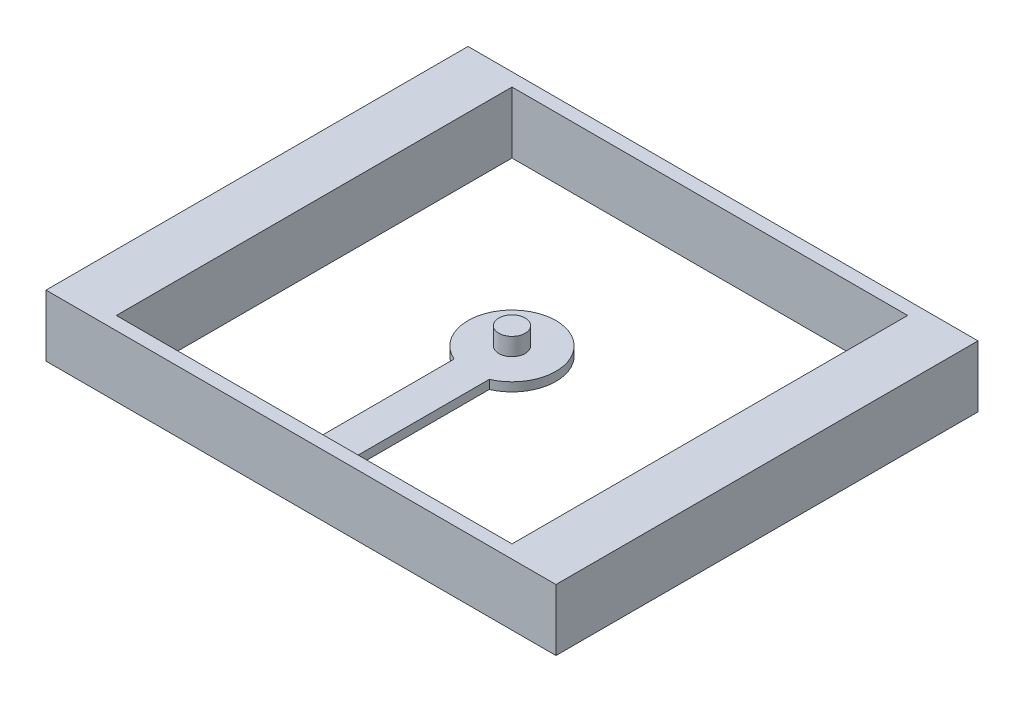
ISO-10303-21;
HEADER;
FILE_DESCRIPTION(('STEP AP214'),'2;1');
FILE_NAME('part.step','',(''),(''),'','','');
FILE_SCHEMA(('AUTOMOTIVE_DESIGN { 1 0 10303 214 1 1 1 1 }'));
ENDSEC;
DATA;
#1=APPLICATION_CONTEXT('core data for automotive mechanical design processes');
#2=APPLICATION_PROTOCOL_DEFINITION('international standard','automotive_design',2000,#1);
#3=PRODUCT_CONTEXT('',#1,'mechanical');
#4=PRODUCT('Part','Part','',(#3));
#5=PRODUCT_RELATED_PRODUCT_CATEGORY('part','',(#4));
#6=PRODUCT_DEFINITION_FORMATION('','',#4);
#7=PRODUCT_DEFINITION_CONTEXT('part definition',#1,'design');
#8=PRODUCT_DEFINITION('design','',#6,#7);
#9=PRODUCT_DEFINITION_SHAPE('','',#8);
#10=(LENGTH_UNIT() NAMED_UNIT(*) SI_UNIT(.MILLI.,.METRE.));
#11=(NAMED_UNIT(*) PLANE_ANGLE_UNIT() SI_UNIT($,.RADIAN.));
#12=(NAMED_UNIT(*) SI_UNIT($,.STERADIAN.) SOLID_ANGLE_UNIT());
#13=UNCERTAINTY_MEASURE_WITH_UNIT(LENGTH_MEASURE(1.E-05),#10,'distance_accuracy_value','');
#14=(GEOMETRIC_REPRESENTATION_CONTEXT(3) GLOBAL_UNCERTAINTY_ASSIGNED_CONTEXT((#13)) GLOBAL_UNIT_ASSIGNED_CONTEXT((#10,
#11,#12)) REPRESENTATION_CONTEXT('',''));
#15=CARTESIAN_POINT('',(0.,0.,0.));
#16=DIRECTION('',(0.,0.,1.));
#17=DIRECTION('',(1.,0.,0.));
#18=AXIS2_PLACEMENT_3D('',#15,#16,#17);
#19=CARTESIAN_POINT('',(0.,-3.,0.));
#20=DIRECTION('',(0.,1.,0.));
#21=DIRECTION('',(0.,0.,1.));
#22=AXIS2_PLACEMENT_3D('',#19,#20,#21);
#23=PLANE('',#22);
#24=CARTESIAN_POINT('',(29.,-3.,24.));
#25=DIRECTION('',(0.,1.,0.));
#26=DIRECTION('',(0.,0.,1.));
#27=AXIS2_PLACEMENT_3D('',#24,#25,#26);
#28=CIRCLE('',#27,1.5);
#29=CARTESIAN_POINT('',(29.,-3.,25.5));
#30=VERTEX_POINT('',#29);
#31=EDGE_CURVE('E327',#30,#30,#28,.T.);
#32=ORIENTED_EDGE('',*,*,#31,.F.);
#33=EDGE_LOOP('',(#32));
#34=FACE_BOUND('',#33,.T.);
#35=DIRECTION('',(1.,0.,0.));
#36=VECTOR('',#35,1.);
#37=CARTESIAN_POINT('',(0.,-3.,46.5));
#38=LINE('',#37,#36);
#39=CARTESIAN_POINT('',(27.,-3.,46.5));
#40=VERTEX_POINT('',#39);
#41=CARTESIAN_POINT('',(31.,-3.,46.5));
#42=VERTEX_POINT('',#41);
#43=EDGE_CURVE('E157',#40,#42,#38,.T.);
#44=ORIENTED_EDGE('',*,*,#43,.T.);
#45=DIRECTION('',(0.,0.,-1.));
#46=VECTOR('',#45,1.);
#47=CARTESIAN_POINT('',(31.,-3.,0.));
#48=LINE('',#47,#46);
#49=CARTESIAN_POINT('',(31.,-3.,28.5825756949558));
#50=VERTEX_POINT('',#49);
#51=EDGE_CURVE('E139',#42,#50,#48,.T.);
#52=ORIENTED_EDGE('',*,*,#51,.T.);
#53=CARTESIAN_POINT('',(29.,-3.,24.));
#54=DIRECTION('',(0.,1.,0.));
#55=DIRECTION('',(0.,0.,1.));
#56=AXIS2_PLACEMENT_3D('',#53,#54,#55);
#57=CIRCLE('',#56,5.);
#58=CARTESIAN_POINT('',(27.,-3.,28.5825756949558));
#59=VERTEX_POINT('',#58);
#60=EDGE_CURVE('E148',#50,#59,#57,.T.);
#61=ORIENTED_EDGE('',*,*,#60,.T.);
#62=DIRECTION('',(0.,0.,-1.));
#63=VECTOR('',#62,1.);
#64=CARTESIAN_POINT('',(27.,-3.,0.));
#65=LINE('',#64,#63);
#66=EDGE_CURVE('E145',#40,#59,#65,.T.);
#67=ORIENTED_EDGE('',*,*,#66,.F.);
#68=EDGE_LOOP('',(#44,#52,#61,#67));
#69=FACE_BOUND('',#68,.T.);
#70=ADVANCED_FACE('F47',(#34,#69),#23,.T.);
#71=CARTESIAN_POINT('',(0.,-7.,48.));
#72=DIRECTION('',(0.,1.,0.));
#73=DIRECTION('',(0.,0.,1.));
#74=AXIS2_PLACEMENT_3D('',#71,#72,#73);
#75=PLANE('',#74);
#76=DIRECTION('',(1.,0.,0.));
#77=VECTOR('',#76,1.);
#78=CARTESIAN_POINT('',(0.,-7.,0.));
#79=LINE('',#78,#77);
#80=CARTESIAN_POINT('',(0.,-7.,0.));
#81=VERTEX_POINT('',#80);
#82=CARTESIAN_POINT('',(58.,-7.,0.));
#83=VERTEX_POINT('',#82);
#84=EDGE_CURVE('E240',#81,#83,#79,.T.);
#85=ORIENTED_EDGE('',*,*,#84,.T.);
#86=DIRECTION('',(0.,0.,-1.));
#87=VECTOR('',#86,1.);
#88=CARTESIAN_POINT('',(58.,-7.,48.));
#89=LINE('',#88,#87);
#90=CARTESIAN_POINT('',(58.,-7.,48.));
#91=VERTEX_POINT('',#90);
#92=EDGE_CURVE('E255',#91,#83,#89,.T.);
#93=ORIENTED_EDGE('',*,*,#92,.F.);
#94=DIRECTION('',(1.,0.,0.));
#95=VECTOR('',#94,1.);
#96=CARTESIAN_POINT('',(0.,-7.,48.));
#97=LINE('',#96,#95);
#98=CARTESIAN_POINT('',(0.,-7.,48.));
#99=VERTEX_POINT('',#98);
#100=EDGE_CURVE('E226',#99,#91,#97,.T.);
#101=ORIENTED_EDGE('',*,*,#100,.F.);
#102=DIRECTION('',(0.,0.,-1.));
#103=VECTOR('',#102,1.);
#104=CARTESIAN_POINT('',(0.,-7.,48.));
#105=LINE('',#104,#103);
#106=EDGE_CURVE('E259',#99,#81,#105,.T.);
#107=ORIENTED_EDGE('',*,*,#106,.T.);
#108=EDGE_LOOP('',(#85,#93,#101,#107));
#109=FACE_BOUND('',#108,.T.);
#110=DIRECTION('',(0.,0.,-1.));
#111=VECTOR('',#110,1.);
#112=CARTESIAN_POINT('',(51.5,-7.,0.));
#113=LINE('',#112,#111);
#114=CARTESIAN_POINT('',(51.5,-7.,46.5));
#115=VERTEX_POINT('',#114);
#116=CARTESIAN_POINT('',(51.5,-7.,1.5));
#117=VERTEX_POINT('',#116);
#118=EDGE_CURVE('E166',#115,#117,#113,.T.);
#119=ORIENTED_EDGE('',*,*,#118,.T.);
#120=DIRECTION('',(1.,0.,0.));
#121=VECTOR('',#120,1.);
#122=CARTESIAN_POINT('',(0.,-7.,1.5));
#123=LINE('',#122,#121);
#124=CARTESIAN_POINT('',(6.50000000000001,-7.,1.5));
#125=VERTEX_POINT('',#124);
#126=EDGE_CURVE('E176',#125,#117,#123,.T.);
#127=ORIENTED_EDGE('',*,*,#126,.F.);
#128=DIRECTION('',(0.,0.,-1.));
#129=VECTOR('',#128,1.);
#130=CARTESIAN_POINT('',(6.50000000000001,-7.,0.));
#131=LINE('',#130,#129);
#132=CARTESIAN_POINT('',(6.50000000000001,-7.,46.5));
#133=VERTEX_POINT('',#132);
#134=EDGE_CURVE('E184',#133,#125,#131,.T.);
#135=ORIENTED_EDGE('',*,*,#134,.F.);
#136=DIRECTION('',(1.,0.,0.));
#137=VECTOR('',#136,1.);
#138=CARTESIAN_POINT('',(0.,-7.,46.5));
#139=LINE('',#138,#137);
#140=EDGE_CURVE('E180',#133,#115,#139,.T.);
#141=ORIENTED_EDGE('',*,*,#140,.T.);
#142=EDGE_LOOP('',(#119,#127,#135,#141));
#143=FACE_BOUND('',#142,.T.);
#144=ADVANCED_FACE('F290',(#109,#143),#75,.F.);
#145=CARTESIAN_POINT('',(0.,0.,48.));
#146=DIRECTION('',(0.,-1.,0.));
#147=DIRECTION('',(0.,0.,-1.));
#148=AXIS2_PLACEMENT_3D('',#145,#146,#147);
#149=PLANE('',#148);
#150=DIRECTION('',(-1.,0.,0.));
#151=VECTOR('',#150,1.);
#152=CARTESIAN_POINT('',(0.,0.,0.));
#153=LINE('',#152,#151);
#154=CARTESIAN_POINT('',(58.,0.,0.));
#155=VERTEX_POINT('',#154);
#156=CARTESIAN_POINT('',(0.,0.,0.));
#157=VERTEX_POINT('',#156);
#158=EDGE_CURVE('E227',#155,#157,#153,.T.);
#159=ORIENTED_EDGE('',*,*,#158,.T.);
#160=DIRECTION('',(0.,0.,-1.));
#161=VECTOR('',#160,1.);
#162=CARTESIAN_POINT('',(0.,0.,48.));
#163=LINE('',#162,#161);
#164=CARTESIAN_POINT('',(0.,0.,48.));
#165=VERTEX_POINT('',#164);
#166=EDGE_CURVE('E236',#165,#157,#163,.T.);
#167=ORIENTED_EDGE('',*,*,#166,.F.);
#168=DIRECTION('',(-1.,0.,0.));
#169=VECTOR('',#168,1.);
#170=CARTESIAN_POINT('',(0.,0.,48.));
#171=LINE('',#170,#169);
#172=CARTESIAN_POINT('',(58.,0.,48.));
#173=VERTEX_POINT('',#172);
#174=EDGE_CURVE('E233',#173,#165,#171,.T.);
#175=ORIENTED_EDGE('',*,*,#174,.F.);
#176=DIRECTION('',(0.,0.,-1.));
#177=VECTOR('',#176,1.);
#178=CARTESIAN_POINT('',(58.,0.,48.));
#179=LINE('',#178,#177);
#180=EDGE_CURVE('E251',#173,#155,#179,.T.);
#181=ORIENTED_EDGE('',*,*,#180,.T.);
#182=EDGE_LOOP('',(#159,#167,#175,#181));
#183=FACE_BOUND('',#182,.T.);
#184=DIRECTION('',(0.,0.,1.));
#185=VECTOR('',#184,1.);
#186=CARTESIAN_POINT('',(51.5,0.,0.));
#187=LINE('',#186,#185);
#188=CARTESIAN_POINT('',(51.5,0.,1.50000000000001));
#189=VERTEX_POINT('',#188);
#190=CARTESIAN_POINT('',(51.5,0.,46.5));
#191=VERTEX_POINT('',#190);
#192=EDGE_CURVE('E175',#189,#191,#187,.T.);
#193=ORIENTED_EDGE('',*,*,#192,.T.);
#194=DIRECTION('',(1.,0.,0.));
#195=VECTOR('',#194,1.);
#196=CARTESIAN_POINT('',(0.,0.,46.5));
#197=LINE('',#196,#195);
#198=CARTESIAN_POINT('',(6.50000000000001,0.,46.5));
#199=VERTEX_POINT('',#198);
#200=EDGE_CURVE('E194',#199,#191,#197,.T.);
#201=ORIENTED_EDGE('',*,*,#200,.F.);
#202=DIRECTION('',(0.,0.,1.));
#203=VECTOR('',#202,1.);
#204=CARTESIAN_POINT('',(6.50000000000001,0.,0.));
#205=LINE('',#204,#203);
#206=CARTESIAN_POINT('',(6.50000000000001,0.,1.50000000000001));
#207=VERTEX_POINT('',#206);
#208=EDGE_CURVE('E202',#207,#199,#205,.T.);
#209=ORIENTED_EDGE('',*,*,#208,.F.);
#210=DIRECTION('',(1.,0.,0.));
#211=VECTOR('',#210,1.);
#212=CARTESIAN_POINT('',(0.,0.,1.50000000000001));
#213=LINE('',#212,#211);
#214=EDGE_CURVE('E198',#207,#189,#213,.T.);
#215=ORIENTED_EDGE('',*,*,#214,.T.);
#216=EDGE_LOOP('',(#193,#201,#209,#215));
#217=FACE_BOUND('',#216,.T.);
#218=ADVANCED_FACE('F282',(#183,#217),#149,.F.);
#219=CARTESIAN_POINT('',(0.,0.,48.));
#220=DIRECTION('',(1.,0.,0.));
#221=DIRECTION('',(0.,1.,0.));
#222=AXIS2_PLACEMENT_3D('',#219,#220,#221);
#223=PLANE('',#222);
#224=DIRECTION('',(0.,-1.,0.));
#225=VECTOR('',#224,1.);
#226=CARTESIAN_POINT('',(0.,0.,0.));
#227=LINE('',#226,#225);
#228=EDGE_CURVE('E212',#157,#81,#227,.T.);
#229=ORIENTED_EDGE('',*,*,#228,.T.);
#230=ORIENTED_EDGE('',*,*,#106,.F.);
#231=DIRECTION('',(0.,-1.,0.));
#232=VECTOR('',#231,1.);
#233=CARTESIAN_POINT('',(0.,0.,48.));
#234=LINE('',#233,#232);
#235=EDGE_CURVE('E222',#165,#99,#234,.T.);
#236=ORIENTED_EDGE('',*,*,#235,.F.);
#237=ORIENTED_EDGE('',*,*,#166,.T.);
#238=EDGE_LOOP('',(#229,#230,#236,#237));
#239=FACE_BOUND('',#238,.T.);
#240=ADVANCED_FACE('F49',(#239),#223,.F.);
#241=CARTESIAN_POINT('',(58.,0.,48.));
#242=DIRECTION('',(-1.,0.,0.));
#243=DIRECTION('',(0.,0.,1.));
#244=AXIS2_PLACEMENT_3D('',#241,#242,#243);
#245=PLANE('',#244);
#246=DIRECTION('',(0.,1.,0.));
#247=VECTOR('',#246,1.);
#248=CARTESIAN_POINT('',(58.,0.,0.));
#249=LINE('',#248,#247);
#250=EDGE_CURVE('E243',#83,#155,#249,.T.);
#251=ORIENTED_EDGE('',*,*,#250,.T.);
#252=ORIENTED_EDGE('',*,*,#180,.F.);
#253=DIRECTION('',(0.,1.,0.));
#254=VECTOR('',#253,1.);
#255=CARTESIAN_POINT('',(58.,0.,48.));
#256=LINE('',#255,#254);
#257=EDGE_CURVE('E230',#91,#173,#256,.T.);
#258=ORIENTED_EDGE('',*,*,#257,.F.);
#259=ORIENTED_EDGE('',*,*,#92,.T.);
#260=EDGE_LOOP('',(#251,#252,#258,#259));
#261=FACE_BOUND('',#260,.T.);
#262=ADVANCED_FACE('F416',(#261),#245,.F.);
#263=CARTESIAN_POINT('',(0.,0.,48.));
#264=DIRECTION('',(0.,0.,1.));
#265=DIRECTION('',(1.,0.,0.));
#266=AXIS2_PLACEMENT_3D('',#263,#264,#265);
#267=PLANE('',#266);
#268=ORIENTED_EDGE('',*,*,#235,.T.);
#269=ORIENTED_EDGE('',*,*,#100,.T.);
#270=ORIENTED_EDGE('',*,*,#257,.T.);
#271=ORIENTED_EDGE('',*,*,#174,.T.);
#272=EDGE_LOOP('',(#268,#269,#270,#271));
#273=FACE_BOUND('',#272,.T.);
#274=ADVANCED_FACE('F408',(#273),#267,.T.);
#275=CARTESIAN_POINT('',(0.,0.,0.));
#276=DIRECTION('',(0.,0.,1.));
#277=DIRECTION('',(1.,0.,0.));
#278=AXIS2_PLACEMENT_3D('',#275,#276,#277);
#279=PLANE('',#278);
#280=ORIENTED_EDGE('',*,*,#228,.F.);
#281=ORIENTED_EDGE('',*,*,#158,.F.);
#282=ORIENTED_EDGE('',*,*,#250,.F.);
#283=ORIENTED_EDGE('',*,*,#84,.F.);
#284=EDGE_LOOP('',(#280,#281,#282,#283));
#285=FACE_BOUND('',#284,.T.);
#286=ADVANCED_FACE('F385',(#285),#279,.F.);
#287=CARTESIAN_POINT('',(51.5,-3.,0.));
#288=DIRECTION('',(-1.,0.,0.));
#289=DIRECTION('',(0.,0.,1.));
#290=AXIS2_PLACEMENT_3D('',#287,#288,#289);
#291=PLANE('',#290);
#292=ORIENTED_EDGE('',*,*,#192,.F.);
#293=DIRECTION('',(0.,1.,0.));
#294=VECTOR('',#293,1.);
#295=CARTESIAN_POINT('',(51.5,-3.,1.50000000000001));
#296=LINE('',#295,#294);
#297=EDGE_CURVE('E193',#117,#189,#296,.T.);
#298=ORIENTED_EDGE('',*,*,#297,.F.);
#299=ORIENTED_EDGE('',*,*,#118,.F.);
#300=DIRECTION('',(0.,1.,0.));
#301=VECTOR('',#300,1.);
#302=CARTESIAN_POINT('',(51.5,-3.,46.5));
#303=LINE('',#302,#301);
#304=EDGE_CURVE('E209',#115,#191,#303,.T.);
#305=ORIENTED_EDGE('',*,*,#304,.T.);
#306=EDGE_LOOP('',(#292,#298,#299,#305));
#307=FACE_BOUND('',#306,.T.);
#308=ADVANCED_FACE('F275',(#307),#291,.T.);
#309=CARTESIAN_POINT('',(0.,-3.,46.5));
#310=DIRECTION('',(0.,0.,1.));
#311=DIRECTION('',(1.,0.,0.));
#312=AXIS2_PLACEMENT_3D('',#309,#310,#311);
#313=PLANE('',#312);
#314=ORIENTED_EDGE('',*,*,#43,.F.);
#315=DIRECTION('',(0.,1.,0.));
#316=VECTOR('',#315,1.);
#317=CARTESIAN_POINT('',(27.,-6.,46.5));
#318=LINE('',#317,#316);
#319=CARTESIAN_POINT('',(27.,-4.,46.5));
#320=VERTEX_POINT('',#319);
#321=EDGE_CURVE('E62',#320,#40,#318,.T.);
#322=ORIENTED_EDGE('',*,*,#321,.F.);
#323=DIRECTION('',(1.,0.,0.));
#324=VECTOR('',#323,1.);
#325=CARTESIAN_POINT('',(0.,-4.,46.5));
#326=LINE('',#325,#324);
#327=CARTESIAN_POINT('',(31.,-4.,46.5));
#328=VERTEX_POINT('',#327);
#329=EDGE_CURVE('E171',#320,#328,#326,.T.);
#330=ORIENTED_EDGE('',*,*,#329,.T.);
#331=DIRECTION('',(0.,1.,0.));
#332=VECTOR('',#331,1.);
#333=CARTESIAN_POINT('',(31.,-6.,46.5));
#334=LINE('',#333,#332);
#335=EDGE_CURVE('E70',#328,#42,#334,.T.);
#336=ORIENTED_EDGE('',*,*,#335,.T.);
#337=EDGE_LOOP('',(#314,#322,#330,#336));
#338=FACE_BOUND('',#337,.T.);
#339=ORIENTED_EDGE('',*,*,#200,.T.);
#340=ORIENTED_EDGE('',*,*,#304,.F.);
#341=ORIENTED_EDGE('',*,*,#140,.F.);
#342=DIRECTION('',(0.,1.,0.));
#343=VECTOR('',#342,1.);
#344=CARTESIAN_POINT('',(6.50000000000001,-3.,46.5));
#345=LINE('',#344,#343);
#346=EDGE_CURVE('E213',#133,#199,#345,.T.);
#347=ORIENTED_EDGE('',*,*,#346,.T.);
#348=EDGE_LOOP('',(#339,#340,#341,#347));
#349=FACE_BOUND('',#348,.T.);
#350=ADVANCED_FACE('F271',(#338,#349),#313,.F.);
#351=CARTESIAN_POINT('',(6.50000000000001,-3.,0.));
#352=DIRECTION('',(-1.,0.,0.));
#353=DIRECTION('',(0.,0.,1.));
#354=AXIS2_PLACEMENT_3D('',#351,#352,#353);
#355=PLANE('',#354);
#356=ORIENTED_EDGE('',*,*,#208,.T.);
#357=ORIENTED_EDGE('',*,*,#346,.F.);
#358=ORIENTED_EDGE('',*,*,#134,.T.);
#359=DIRECTION('',(0.,1.,0.));
#360=VECTOR('',#359,1.);
#361=CARTESIAN_POINT('',(6.50000000000001,-3.,1.50000000000001));
#362=LINE('',#361,#360);
#363=EDGE_CURVE('E216',#125,#207,#362,.T.);
#364=ORIENTED_EDGE('',*,*,#363,.T.);
#365=EDGE_LOOP('',(#356,#357,#358,#364));
#366=FACE_BOUND('',#365,.T.);
#367=ADVANCED_FACE('F274',(#366),#355,.F.);
#368=CARTESIAN_POINT('',(0.,-3.,1.50000000000001));
#369=DIRECTION('',(0.,0.,1.));
#370=DIRECTION('',(1.,0.,0.));
#371=AXIS2_PLACEMENT_3D('',#368,#369,#370);
#372=PLANE('',#371);
#373=ORIENTED_EDGE('',*,*,#214,.F.);
#374=ORIENTED_EDGE('',*,*,#363,.F.);
#375=ORIENTED_EDGE('',*,*,#126,.T.);
#376=ORIENTED_EDGE('',*,*,#297,.T.);
#377=EDGE_LOOP('',(#373,#374,#375,#376));
#378=FACE_BOUND('',#377,.T.);
#379=ADVANCED_FACE('F286',(#378),#372,.T.);
#380=CARTESIAN_POINT('',(0.,-4.,0.));
#381=DIRECTION('',(0.,-1.,0.));
#382=DIRECTION('',(0.,0.,-1.));
#383=AXIS2_PLACEMENT_3D('',#380,#381,#382);
#384=PLANE('',#383);
#385=DIRECTION('',(0.,0.,1.));
#386=VECTOR('',#385,1.);
#387=CARTESIAN_POINT('',(27.,-4.,0.));
#388=LINE('',#387,#386);
#389=CARTESIAN_POINT('',(27.,-4.,28.5825756949558));
#390=VERTEX_POINT('',#389);
#391=EDGE_CURVE('E11',#390,#320,#388,.T.);
#392=ORIENTED_EDGE('',*,*,#391,.F.);
#393=CARTESIAN_POINT('',(29.,-4.,24.));
#394=DIRECTION('',(0.,-1.,0.));
#395=DIRECTION('',(0.,0.,-1.));
#396=AXIS2_PLACEMENT_3D('',#393,#394,#395);
#397=CIRCLE('',#396,5.);
#398=CARTESIAN_POINT('',(31.,-4.,28.5825756949558));
#399=VERTEX_POINT('',#398);
#400=EDGE_CURVE('E56',#390,#399,#397,.T.);
#401=ORIENTED_EDGE('',*,*,#400,.T.);
#402=DIRECTION('',(0.,0.,1.));
#403=VECTOR('',#402,1.);
#404=CARTESIAN_POINT('',(31.,-4.,0.));
#405=LINE('',#404,#403);
#406=EDGE_CURVE('E141',#399,#328,#405,.T.);
#407=ORIENTED_EDGE('',*,*,#406,.T.);
#408=ORIENTED_EDGE('',*,*,#329,.F.);
#409=EDGE_LOOP('',(#392,#401,#407,#408));
#410=FACE_BOUND('',#409,.T.);
#411=ADVANCED_FACE('F267',(#410),#384,.T.);
#412=CARTESIAN_POINT('',(29.,-6.,24.));
#413=DIRECTION('',(0.,1.,0.));
#414=DIRECTION('',(0.,0.,1.));
#415=AXIS2_PLACEMENT_3D('',#412,#413,#414);
#416=CYLINDRICAL_SURFACE('',#415,5.);
#417=DIRECTION('',(0.,1.,0.));
#418=VECTOR('',#417,1.);
#419=CARTESIAN_POINT('',(27.,-6.,28.5825756949558));
#420=LINE('',#419,#418);
#421=EDGE_CURVE('E151',#390,#59,#420,.T.);
#422=ORIENTED_EDGE('',*,*,#421,.T.);
#423=ORIENTED_EDGE('',*,*,#60,.F.);
#424=DIRECTION('',(0.,1.,0.));
#425=VECTOR('',#424,1.);
#426=CARTESIAN_POINT('',(31.,-6.,28.5825756949558));
#427=LINE('',#426,#425);
#428=EDGE_CURVE('E135',#399,#50,#427,.T.);
#429=ORIENTED_EDGE('',*,*,#428,.F.);
#430=ORIENTED_EDGE('',*,*,#400,.F.);
#431=EDGE_LOOP('',(#422,#423,#429,#430));
#432=FACE_BOUND('',#431,.T.);
#433=ADVANCED_FACE('F149',(#432),#416,.T.);
#434=CARTESIAN_POINT('',(27.,-6.,0.));
#435=DIRECTION('',(1.,0.,0.));
#436=DIRECTION('',(0.,0.,-1.));
#437=AXIS2_PLACEMENT_3D('',#434,#435,#436);
#438=PLANE('',#437);
#439=ORIENTED_EDGE('',*,*,#391,.T.);
#440=ORIENTED_EDGE('',*,*,#321,.T.);
#441=ORIENTED_EDGE('',*,*,#66,.T.);
#442=ORIENTED_EDGE('',*,*,#421,.F.);
#443=EDGE_LOOP('',(#439,#440,#441,#442));
#444=FACE_BOUND('',#443,.T.);
#445=ADVANCED_FACE('F269',(#444),#438,.F.);
#446=CARTESIAN_POINT('',(31.,-6.,0.));
#447=DIRECTION('',(1.,0.,0.));
#448=DIRECTION('',(0.,0.,-1.));
#449=AXIS2_PLACEMENT_3D('',#446,#447,#448);
#450=PLANE('',#449);
#451=ORIENTED_EDGE('',*,*,#428,.T.);
#452=ORIENTED_EDGE('',*,*,#51,.F.);
#453=ORIENTED_EDGE('',*,*,#335,.F.);
#454=ORIENTED_EDGE('',*,*,#406,.F.);
#455=EDGE_LOOP('',(#451,#452,#453,#454));
#456=FACE_BOUND('',#455,.T.);
#457=ADVANCED_FACE('F137',(#456),#450,.T.);
#458=CARTESIAN_POINT('',(29.,-1.,24.));
#459=DIRECTION('',(0.,-1.,0.));
#460=DIRECTION('',(0.,0.,-1.));
#461=AXIS2_PLACEMENT_3D('',#458,#459,#460);
#462=CYLINDRICAL_SURFACE('',#461,1.5);
#463=CARTESIAN_POINT('',(29.,-1.,24.));
#464=DIRECTION('',(0.,1.,0.));
#465=DIRECTION('',(0.,0.,1.));
#466=AXIS2_PLACEMENT_3D('',#463,#464,#465);
#467=CIRCLE('',#466,1.5);
#468=CARTESIAN_POINT('',(29.,-1.,25.5));
#469=VERTEX_POINT('',#468);
#470=EDGE_CURVE('E154',#469,#469,#467,.T.);
#471=ORIENTED_EDGE('',*,*,#470,.F.);
#472=EDGE_LOOP('',(#471));
#473=FACE_BOUND('',#472,.T.);
#474=ORIENTED_EDGE('',*,*,#31,.T.);
#475=EDGE_LOOP('',(#474));
#476=FACE_BOUND('',#475,.T.);
#477=ADVANCED_FACE('F314',(#473,#476),#462,.T.);
#478=CARTESIAN_POINT('',(29.,-1.,24.));
#479=DIRECTION('',(0.,1.,0.));
#480=DIRECTION('',(0.,0.,1.));
#481=AXIS2_PLACEMENT_3D('',#478,#479,#480);
#482=PLANE('',#481);
#483=ORIENTED_EDGE('',*,*,#470,.T.);
#484=EDGE_LOOP('',(#483));
#485=FACE_BOUND('',#484,.T.);
#486=ADVANCED_FACE('F318',(#485),#482,.T.);
#487=CLOSED_SHELL('',(#70,#144,#218,#240,#262,#274,#286,#308,#350,#367,#379,#411,#433,#445,#457,
#477,#486));
#488=MANIFOLD_SOLID_BREP('B2',#487);
#489=ADVANCED_BREP_SHAPE_REPRESENTATION('',(#18,#488),#14);
#490=SHAPE_DEFINITION_REPRESENTATION(#9,#489);
ENDSEC;
END-ISO-10303-21;
